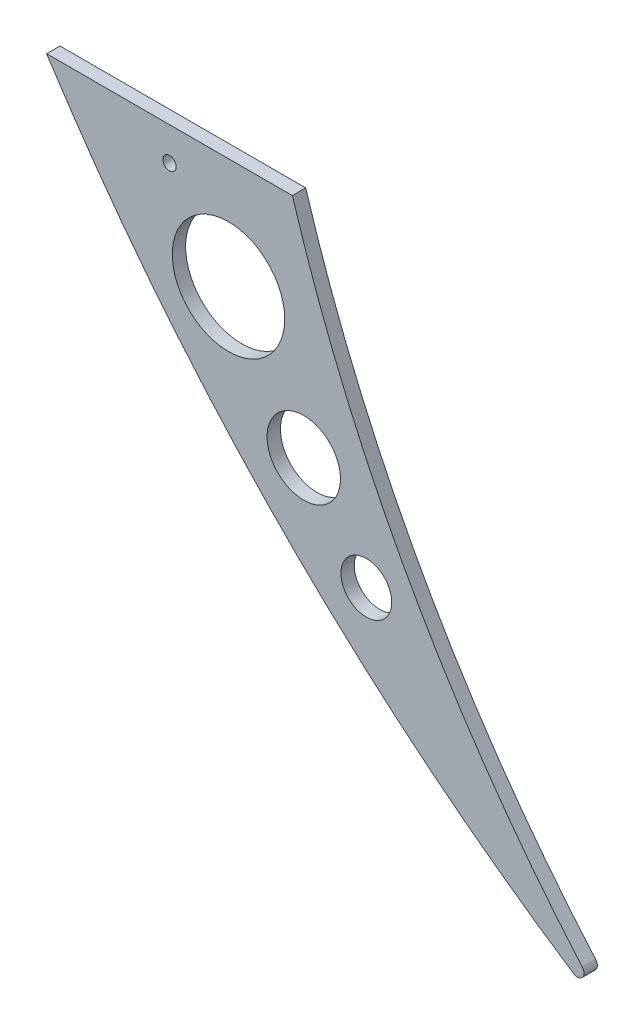
ISO-10303-21;
HEADER;
FILE_DESCRIPTION(('STEP AP214'),'2;1');
FILE_NAME('part.step','',(''),(''),'','','');
FILE_SCHEMA(('AUTOMOTIVE_DESIGN { 1 0 10303 214 1 1 1 1 }'));
ENDSEC;
DATA;
#1=APPLICATION_CONTEXT('core data for automotive mechanical design processes');
#2=APPLICATION_PROTOCOL_DEFINITION('international standard','automotive_design',2000,#1);
#3=PRODUCT_CONTEXT('',#1,'mechanical');
#4=PRODUCT('Part','Part','',(#3));
#5=PRODUCT_RELATED_PRODUCT_CATEGORY('part','',(#4));
#6=PRODUCT_DEFINITION_FORMATION('','',#4);
#7=PRODUCT_DEFINITION_CONTEXT('part definition',#1,'design');
#8=PRODUCT_DEFINITION('design','',#6,#7);
#9=PRODUCT_DEFINITION_SHAPE('','',#8);
#10=(LENGTH_UNIT() NAMED_UNIT(*) SI_UNIT(.MILLI.,.METRE.));
#11=(NAMED_UNIT(*) PLANE_ANGLE_UNIT() SI_UNIT($,.RADIAN.));
#12=(NAMED_UNIT(*) SI_UNIT($,.STERADIAN.) SOLID_ANGLE_UNIT());
#13=UNCERTAINTY_MEASURE_WITH_UNIT(LENGTH_MEASURE(1.E-05),#10,'distance_accuracy_value','');
#14=(GEOMETRIC_REPRESENTATION_CONTEXT(3) GLOBAL_UNCERTAINTY_ASSIGNED_CONTEXT((#13)) GLOBAL_UNIT_ASSIGNED_CONTEXT((#10,
#11,#12)) REPRESENTATION_CONTEXT('',''));
#15=CARTESIAN_POINT('',(0.,0.,0.));
#16=DIRECTION('',(0.,0.,1.));
#17=DIRECTION('',(1.,0.,0.));
#18=AXIS2_PLACEMENT_3D('',#15,#16,#17);
#19=CARTESIAN_POINT('',(4221.56485351635,1413.62969781953,2.));
#20=DIRECTION('',(0.,0.,1.));
#21=DIRECTION('',(1.,0.,0.));
#22=AXIS2_PLACEMENT_3D('',#19,#20,#21);
#23=PLANE('',#22);
#24=CARTESIAN_POINT('',(4032.7948506151,1234.77717773128,2.));
#25=DIRECTION('',(0.,0.,1.));
#26=DIRECTION('',(1.,0.,0.));
#27=AXIS2_PLACEMENT_3D('',#24,#25,#26);
#28=CIRCLE('',#27,5.5064492400474);
#29=CARTESIAN_POINT('',(4038.30129985515,1234.77717773128,2.));
#30=VERTEX_POINT('',#29);
#31=EDGE_CURVE('E120',#30,#30,#28,.T.);
#32=ORIENTED_EDGE('',*,*,#31,.F.);
#33=EDGE_LOOP('',(#32));
#34=FACE_BOUND('',#33,.T.);
#35=CARTESIAN_POINT('',(4042.1824677544,1222.5895375817,2.));
#36=DIRECTION('',(0.,0.,1.));
#37=DIRECTION('',(1.,0.,0.));
#38=AXIS2_PLACEMENT_3D('',#35,#36,#37);
#39=CIRCLE('',#38,3.81183096838811);
#40=CARTESIAN_POINT('',(4045.99429872279,1222.5895375817,2.));
#41=VERTEX_POINT('',#40);
#42=EDGE_CURVE('E99',#41,#41,#39,.T.);
#43=ORIENTED_EDGE('',*,*,#42,.F.);
#44=EDGE_LOOP('',(#43));
#45=FACE_BOUND('',#44,.T.);
#46=CARTESIAN_POINT('',(4221.56485351635,1413.62969781953,2.));
#47=DIRECTION('',(0.,0.,1.));
#48=DIRECTION('',(1.,0.,0.));
#49=AXIS2_PLACEMENT_3D('',#46,#47,#48);
#50=CIRCLE('',#49,269.988340943463);
#51=CARTESIAN_POINT('',(3994.22083937732,1267.99864522235,2.));
#52=VERTEX_POINT('',#51);
#53=CARTESIAN_POINT('',(4073.29370882083,1187.99864522243,2.));
#54=VERTEX_POINT('',#53);
#55=EDGE_CURVE('E84',#52,#54,#50,.T.);
#56=ORIENTED_EDGE('',*,*,#55,.T.);
#57=CARTESIAN_POINT('',(4073.84288492285,1188.83435187489,2.));
#58=DIRECTION('',(0.,0.,1.));
#59=DIRECTION('',(1.,0.,0.));
#60=AXIS2_PLACEMENT_3D('',#57,#58,#59);
#61=CIRCLE('',#60,1.00000000000029);
#62=CARTESIAN_POINT('',(4074.5980312815,1189.48990810971,2.));
#63=VERTEX_POINT('',#62);
#64=EDGE_CURVE('E79',#54,#63,#61,.T.);
#65=ORIENTED_EDGE('',*,*,#64,.T.);
#66=CARTESIAN_POINT('',(4238.06781669863,1331.40099041706,2.));
#67=DIRECTION('',(0.,0.,-1.));
#68=DIRECTION('',(1.,0.,0.));
#69=AXIS2_PLACEMENT_3D('',#66,#67,#68);
#70=CIRCLE('',#69,216.474308004362);
#71=CARTESIAN_POINT('',(4031.08649230006,1267.9986452224,2.));
#72=VERTEX_POINT('',#71);
#73=EDGE_CURVE('E82',#63,#72,#70,.T.);
#74=ORIENTED_EDGE('',*,*,#73,.T.);
#75=DIRECTION('',(-1.,-1.30098427293094E-12,0.));
#76=VECTOR('',#75,1.);
#77=CARTESIAN_POINT('',(4031.08649230006,1267.9986452224,2.));
#78=LINE('',#77,#76);
#79=EDGE_CURVE('E49',#72,#52,#78,.T.);
#80=ORIENTED_EDGE('',*,*,#79,.T.);
#81=EDGE_LOOP('',(#56,#65,#74,#80));
#82=FACE_BOUND('',#81,.T.);
#83=CARTESIAN_POINT('',(4021.50492168572,1251.37487070111,2.));
#84=DIRECTION('',(0.,0.,1.));
#85=DIRECTION('',(1.,0.,0.));
#86=AXIS2_PLACEMENT_3D('',#83,#84,#85);
#87=CIRCLE('',#86,8.43371364906975);
#88=CARTESIAN_POINT('',(4029.93863533479,1251.37487070111,2.));
#89=VERTEX_POINT('',#88);
#90=EDGE_CURVE('E114',#89,#89,#87,.T.);
#91=ORIENTED_EDGE('',*,*,#90,.F.);
#92=EDGE_LOOP('',(#91));
#93=FACE_BOUND('',#92,.T.);
#94=CARTESIAN_POINT('',(4012.65366583869,1262.9986452224,2.));
#95=DIRECTION('',(0.,0.,1.));
#96=DIRECTION('',(1.,0.,0.));
#97=AXIS2_PLACEMENT_3D('',#94,#95,#96);
#98=CIRCLE('',#97,1.00000000000005);
#99=CARTESIAN_POINT('',(4013.65366583869,1262.9986452224,2.));
#100=VERTEX_POINT('',#99);
#101=EDGE_CURVE('E126',#100,#100,#98,.T.);
#102=ORIENTED_EDGE('',*,*,#101,.F.);
#103=EDGE_LOOP('',(#102));
#104=FACE_BOUND('',#103,.T.);
#105=ADVANCED_FACE('F32',(#34,#45,#82,#93,#104),#23,.T.);
#106=CARTESIAN_POINT('',(4221.56485351635,1413.62969781953,0.));
#107=DIRECTION('',(0.,0.,1.));
#108=DIRECTION('',(1.,0.,0.));
#109=AXIS2_PLACEMENT_3D('',#106,#107,#108);
#110=PLANE('',#109);
#111=CARTESIAN_POINT('',(4032.7948506151,1234.77717773128,0.));
#112=DIRECTION('',(0.,0.,1.));
#113=DIRECTION('',(1.,0.,0.));
#114=AXIS2_PLACEMENT_3D('',#111,#112,#113);
#115=CIRCLE('',#114,5.5064492400474);
#116=CARTESIAN_POINT('',(4038.30129985515,1234.77717773128,0.));
#117=VERTEX_POINT('',#116);
#118=EDGE_CURVE('E123',#117,#117,#115,.T.);
#119=ORIENTED_EDGE('',*,*,#118,.T.);
#120=EDGE_LOOP('',(#119));
#121=FACE_BOUND('',#120,.T.);
#122=CARTESIAN_POINT('',(4042.1824677544,1222.5895375817,0.));
#123=DIRECTION('',(0.,0.,1.));
#124=DIRECTION('',(1.,0.,0.));
#125=AXIS2_PLACEMENT_3D('',#122,#123,#124);
#126=CIRCLE('',#125,3.81183096838811);
#127=CARTESIAN_POINT('',(4045.99429872279,1222.5895375817,0.));
#128=VERTEX_POINT('',#127);
#129=EDGE_CURVE('E111',#128,#128,#126,.T.);
#130=ORIENTED_EDGE('',*,*,#129,.T.);
#131=EDGE_LOOP('',(#130));
#132=FACE_BOUND('',#131,.T.);
#133=CARTESIAN_POINT('',(4221.56485351635,1413.62969781953,0.));
#134=DIRECTION('',(0.,0.,1.));
#135=DIRECTION('',(1.,0.,0.));
#136=AXIS2_PLACEMENT_3D('',#133,#134,#135);
#137=CIRCLE('',#136,269.988340943463);
#138=CARTESIAN_POINT('',(3994.22083937732,1267.99864522235,0.));
#139=VERTEX_POINT('',#138);
#140=CARTESIAN_POINT('',(4073.29370882083,1187.99864522243,0.));
#141=VERTEX_POINT('',#140);
#142=EDGE_CURVE('E96',#139,#141,#137,.T.);
#143=ORIENTED_EDGE('',*,*,#142,.F.);
#144=DIRECTION('',(-1.,-1.30098427293094E-12,0.));
#145=VECTOR('',#144,1.);
#146=CARTESIAN_POINT('',(4031.08649230006,1267.9986452224,0.));
#147=LINE('',#146,#145);
#148=CARTESIAN_POINT('',(4031.08649230006,1267.9986452224,0.));
#149=VERTEX_POINT('',#148);
#150=EDGE_CURVE('E72',#149,#139,#147,.T.);
#151=ORIENTED_EDGE('',*,*,#150,.F.);
#152=CARTESIAN_POINT('',(4238.06781669863,1331.40099041706,0.));
#153=DIRECTION('',(0.,0.,-1.));
#154=DIRECTION('',(1.,0.,0.));
#155=AXIS2_PLACEMENT_3D('',#152,#153,#154);
#156=CIRCLE('',#155,216.474308004362);
#157=CARTESIAN_POINT('',(4074.5980312815,1189.48990810971,0.));
#158=VERTEX_POINT('',#157);
#159=EDGE_CURVE('E66',#158,#149,#156,.T.);
#160=ORIENTED_EDGE('',*,*,#159,.F.);
#161=CARTESIAN_POINT('',(4073.84288492285,1188.83435187489,0.));
#162=DIRECTION('',(0.,0.,1.));
#163=DIRECTION('',(1.,0.,0.));
#164=AXIS2_PLACEMENT_3D('',#161,#162,#163);
#165=CIRCLE('',#164,1.00000000000029);
#166=EDGE_CURVE('E88',#141,#158,#165,.T.);
#167=ORIENTED_EDGE('',*,*,#166,.F.);
#168=EDGE_LOOP('',(#143,#151,#160,#167));
#169=FACE_BOUND('',#168,.T.);
#170=CARTESIAN_POINT('',(4021.50492168572,1251.37487070111,0.));
#171=DIRECTION('',(0.,0.,1.));
#172=DIRECTION('',(1.,0.,0.));
#173=AXIS2_PLACEMENT_3D('',#170,#171,#172);
#174=CIRCLE('',#173,8.43371364906975);
#175=CARTESIAN_POINT('',(4029.93863533479,1251.37487070111,0.));
#176=VERTEX_POINT('',#175);
#177=EDGE_CURVE('E117',#176,#176,#174,.T.);
#178=ORIENTED_EDGE('',*,*,#177,.T.);
#179=EDGE_LOOP('',(#178));
#180=FACE_BOUND('',#179,.T.);
#181=CARTESIAN_POINT('',(4012.65366583869,1262.9986452224,0.));
#182=DIRECTION('',(0.,0.,1.));
#183=DIRECTION('',(1.,0.,0.));
#184=AXIS2_PLACEMENT_3D('',#181,#182,#183);
#185=CIRCLE('',#184,1.00000000000005);
#186=CARTESIAN_POINT('',(4013.65366583869,1262.9986452224,0.));
#187=VERTEX_POINT('',#186);
#188=EDGE_CURVE('E129',#187,#187,#185,.T.);
#189=ORIENTED_EDGE('',*,*,#188,.T.);
#190=EDGE_LOOP('',(#189));
#191=FACE_BOUND('',#190,.T.);
#192=ADVANCED_FACE('F107',(#121,#132,#169,#180,#191),#110,.F.);
#193=CARTESIAN_POINT('',(4221.56485351635,1413.62969781953,2.));
#194=DIRECTION('',(0.,0.,-1.));
#195=DIRECTION('',(-1.,0.,0.));
#196=AXIS2_PLACEMENT_3D('',#193,#194,#195);
#197=CYLINDRICAL_SURFACE('',#196,269.988340943463);
#198=ORIENTED_EDGE('',*,*,#142,.T.);
#199=DIRECTION('',(0.,0.,-1.));
#200=VECTOR('',#199,1.);
#201=CARTESIAN_POINT('',(4073.29370882083,1187.99864522243,2.));
#202=LINE('',#201,#200);
#203=EDGE_CURVE('E11',#54,#141,#202,.T.);
#204=ORIENTED_EDGE('',*,*,#203,.F.);
#205=ORIENTED_EDGE('',*,*,#55,.F.);
#206=DIRECTION('',(0.,0.,-1.));
#207=VECTOR('',#206,1.);
#208=CARTESIAN_POINT('',(3994.22083937732,1267.99864522235,2.));
#209=LINE('',#208,#207);
#210=EDGE_CURVE('E92',#52,#139,#209,.T.);
#211=ORIENTED_EDGE('',*,*,#210,.T.);
#212=EDGE_LOOP('',(#198,#204,#205,#211));
#213=FACE_BOUND('',#212,.T.);
#214=ADVANCED_FACE('F34',(#213),#197,.T.);
#215=CARTESIAN_POINT('',(4073.84288492285,1188.83435187489,2.));
#216=DIRECTION('',(0.,0.,-1.));
#217=DIRECTION('',(-1.,0.,0.));
#218=AXIS2_PLACEMENT_3D('',#215,#216,#217);
#219=CYLINDRICAL_SURFACE('',#218,1.00000000000029);
#220=ORIENTED_EDGE('',*,*,#166,.T.);
#221=DIRECTION('',(0.,0.,-1.));
#222=VECTOR('',#221,1.);
#223=CARTESIAN_POINT('',(4074.5980312815,1189.48990810971,2.));
#224=LINE('',#223,#222);
#225=EDGE_CURVE('E41',#63,#158,#224,.T.);
#226=ORIENTED_EDGE('',*,*,#225,.F.);
#227=ORIENTED_EDGE('',*,*,#64,.F.);
#228=ORIENTED_EDGE('',*,*,#203,.T.);
#229=EDGE_LOOP('',(#220,#226,#227,#228));
#230=FACE_BOUND('',#229,.T.);
#231=ADVANCED_FACE('F87',(#230),#219,.T.);
#232=CARTESIAN_POINT('',(4238.06781669863,1331.40099041706,2.));
#233=DIRECTION('',(0.,0.,-1.));
#234=DIRECTION('',(-1.,0.,0.));
#235=AXIS2_PLACEMENT_3D('',#232,#233,#234);
#236=CYLINDRICAL_SURFACE('',#235,216.474308004362);
#237=ORIENTED_EDGE('',*,*,#159,.T.);
#238=DIRECTION('',(0.,0.,-1.));
#239=VECTOR('',#238,1.);
#240=CARTESIAN_POINT('',(4031.08649230006,1267.9986452224,2.));
#241=LINE('',#240,#239);
#242=EDGE_CURVE('E89',#72,#149,#241,.T.);
#243=ORIENTED_EDGE('',*,*,#242,.F.);
#244=ORIENTED_EDGE('',*,*,#73,.F.);
#245=ORIENTED_EDGE('',*,*,#225,.T.);
#246=EDGE_LOOP('',(#237,#243,#244,#245));
#247=FACE_BOUND('',#246,.T.);
#248=ADVANCED_FACE('F90',(#247),#236,.F.);
#249=CARTESIAN_POINT('',(4031.08649230006,1267.9986452224,2.));
#250=DIRECTION('',(1.30098427293094E-12,-1.,0.));
#251=DIRECTION('',(1.,1.30098427293094E-12,0.));
#252=AXIS2_PLACEMENT_3D('',#249,#250,#251);
#253=PLANE('',#252);
#254=ORIENTED_EDGE('',*,*,#150,.T.);
#255=ORIENTED_EDGE('',*,*,#210,.F.);
#256=ORIENTED_EDGE('',*,*,#79,.F.);
#257=ORIENTED_EDGE('',*,*,#242,.T.);
#258=EDGE_LOOP('',(#254,#255,#256,#257));
#259=FACE_BOUND('',#258,.T.);
#260=ADVANCED_FACE('F104',(#259),#253,.F.);
#261=CARTESIAN_POINT('',(4042.1824677544,1222.5895375817,2.));
#262=DIRECTION('',(0.,0.,-1.));
#263=DIRECTION('',(-1.,0.,0.));
#264=AXIS2_PLACEMENT_3D('',#261,#262,#263);
#265=CYLINDRICAL_SURFACE('',#264,3.81183096838811);
#266=ORIENTED_EDGE('',*,*,#42,.T.);
#267=EDGE_LOOP('',(#266));
#268=FACE_BOUND('',#267,.T.);
#269=ORIENTED_EDGE('',*,*,#129,.F.);
#270=EDGE_LOOP('',(#269));
#271=FACE_BOUND('',#270,.T.);
#272=ADVANCED_FACE('F149',(#268,#271),#265,.F.);
#273=CARTESIAN_POINT('',(4021.50492168572,1251.37487070111,2.));
#274=DIRECTION('',(0.,0.,-1.));
#275=DIRECTION('',(-1.,0.,0.));
#276=AXIS2_PLACEMENT_3D('',#273,#274,#275);
#277=CYLINDRICAL_SURFACE('',#276,8.43371364906975);
#278=ORIENTED_EDGE('',*,*,#90,.T.);
#279=EDGE_LOOP('',(#278));
#280=FACE_BOUND('',#279,.T.);
#281=ORIENTED_EDGE('',*,*,#177,.F.);
#282=EDGE_LOOP('',(#281));
#283=FACE_BOUND('',#282,.T.);
#284=ADVANCED_FACE('F195',(#280,#283),#277,.F.);
#285=CARTESIAN_POINT('',(4032.7948506151,1234.77717773128,2.));
#286=DIRECTION('',(0.,0.,-1.));
#287=DIRECTION('',(-1.,0.,0.));
#288=AXIS2_PLACEMENT_3D('',#285,#286,#287);
#289=CYLINDRICAL_SURFACE('',#288,5.5064492400474);
#290=ORIENTED_EDGE('',*,*,#31,.T.);
#291=EDGE_LOOP('',(#290));
#292=FACE_BOUND('',#291,.T.);
#293=ORIENTED_EDGE('',*,*,#118,.F.);
#294=EDGE_LOOP('',(#293));
#295=FACE_BOUND('',#294,.T.);
#296=ADVANCED_FACE('F203',(#292,#295),#289,.F.);
#297=CARTESIAN_POINT('',(4012.65366583869,1262.9986452224,2.));
#298=DIRECTION('',(0.,0.,-1.));
#299=DIRECTION('',(-1.,0.,0.));
#300=AXIS2_PLACEMENT_3D('',#297,#298,#299);
#301=CYLINDRICAL_SURFACE('',#300,1.00000000000005);
#302=ORIENTED_EDGE('',*,*,#101,.T.);
#303=EDGE_LOOP('',(#302));
#304=FACE_BOUND('',#303,.T.);
#305=ORIENTED_EDGE('',*,*,#188,.F.);
#306=EDGE_LOOP('',(#305));
#307=FACE_BOUND('',#306,.T.);
#308=ADVANCED_FACE('F135',(#304,#307),#301,.F.);
#309=CLOSED_SHELL('',(#105,#192,#214,#231,#248,#260,#272,#284,#296,#308));
#310=MANIFOLD_SOLID_BREP('B2',#309);
#311=ADVANCED_BREP_SHAPE_REPRESENTATION('',(#18,#310),#14);
#312=SHAPE_DEFINITION_REPRESENTATION(#9,#311);
ENDSEC;
END-ISO-10303-21;
